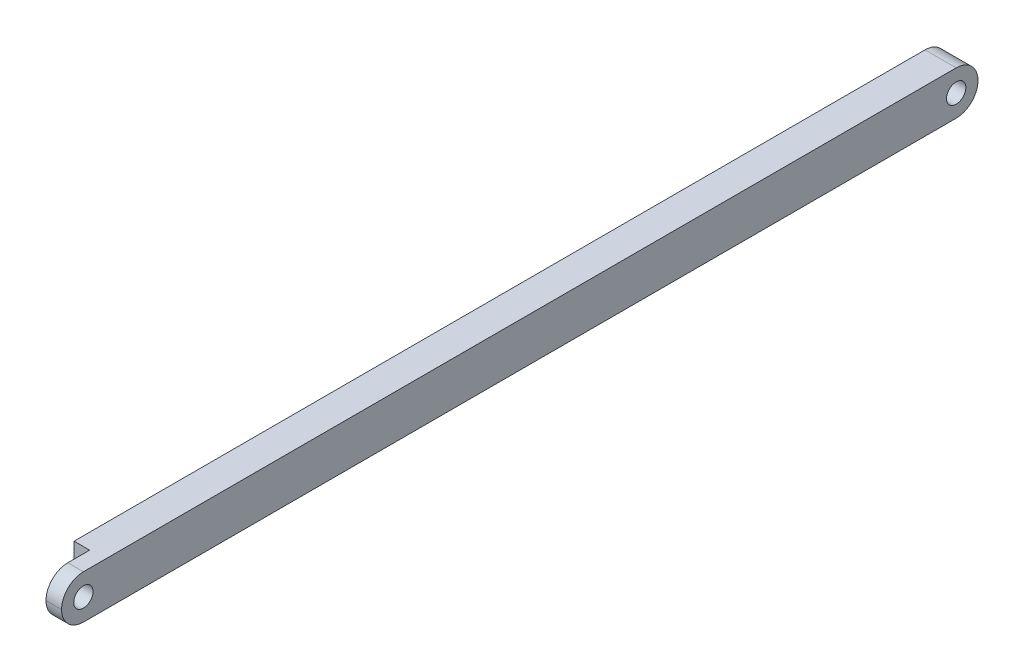
ISO-10303-21;
HEADER;
FILE_DESCRIPTION(('STEP AP214'),'2;1');
FILE_NAME('part.step','',(''),(''),'','','');
FILE_SCHEMA(('AUTOMOTIVE_DESIGN { 1 0 10303 214 1 1 1 1 }'));
ENDSEC;
DATA;
#1=APPLICATION_CONTEXT('core data for automotive mechanical design processes');
#2=APPLICATION_PROTOCOL_DEFINITION('international standard','automotive_design',2000,#1);
#3=PRODUCT_CONTEXT('',#1,'mechanical');
#4=PRODUCT('Part','Part','',(#3));
#5=PRODUCT_RELATED_PRODUCT_CATEGORY('part','',(#4));
#6=PRODUCT_DEFINITION_FORMATION('','',#4);
#7=PRODUCT_DEFINITION_CONTEXT('part definition',#1,'design');
#8=PRODUCT_DEFINITION('design','',#6,#7);
#9=PRODUCT_DEFINITION_SHAPE('','',#8);
#10=(LENGTH_UNIT() NAMED_UNIT(*) SI_UNIT(.MILLI.,.METRE.));
#11=(NAMED_UNIT(*) PLANE_ANGLE_UNIT() SI_UNIT($,.RADIAN.));
#12=(NAMED_UNIT(*) SI_UNIT($,.STERADIAN.) SOLID_ANGLE_UNIT());
#13=UNCERTAINTY_MEASURE_WITH_UNIT(LENGTH_MEASURE(1.E-05),#10,'distance_accuracy_value','');
#14=(GEOMETRIC_REPRESENTATION_CONTEXT(3) GLOBAL_UNCERTAINTY_ASSIGNED_CONTEXT((#13)) GLOBAL_UNIT_ASSIGNED_CONTEXT((#10,
#11,#12)) REPRESENTATION_CONTEXT('',''));
#15=CARTESIAN_POINT('',(0.,0.,0.));
#16=DIRECTION('',(0.,0.,1.));
#17=DIRECTION('',(1.,0.,0.));
#18=AXIS2_PLACEMENT_3D('',#15,#16,#17);
#19=CARTESIAN_POINT('',(2.5,3.5,140.));
#20=DIRECTION('',(-1.,0.,0.));
#21=DIRECTION('',(0.,-1.,0.));
#22=AXIS2_PLACEMENT_3D('',#19,#20,#21);
#23=PLANE('',#22);
#24=CARTESIAN_POINT('',(2.5,0.,143.5));
#25=DIRECTION('',(-1.,0.,0.));
#26=DIRECTION('',(0.,-1.,0.));
#27=AXIS2_PLACEMENT_3D('',#24,#25,#26);
#28=CIRCLE('',#27,1.54999999999999);
#29=CARTESIAN_POINT('',(2.5,-1.55,143.5));
#30=VERTEX_POINT('',#29);
#31=EDGE_CURVE('E121',#30,#30,#28,.T.);
#32=ORIENTED_EDGE('',*,*,#31,.T.);
#33=EDGE_LOOP('',(#32));
#34=FACE_BOUND('',#33,.T.);
#35=CARTESIAN_POINT('',(2.5,0.,3.5));
#36=DIRECTION('',(1.,0.,0.));
#37=DIRECTION('',(0.,1.,0.));
#38=AXIS2_PLACEMENT_3D('',#35,#36,#37);
#39=CIRCLE('',#38,1.55);
#40=CARTESIAN_POINT('',(2.5,1.55,3.5));
#41=VERTEX_POINT('',#40);
#42=EDGE_CURVE('E137',#41,#41,#39,.T.);
#43=ORIENTED_EDGE('',*,*,#42,.F.);
#44=EDGE_LOOP('',(#43));
#45=FACE_BOUND('',#44,.T.);
#46=CARTESIAN_POINT('',(2.5,0.,143.5));
#47=DIRECTION('',(-1.,0.,0.));
#48=DIRECTION('',(0.,-1.,0.));
#49=AXIS2_PLACEMENT_3D('',#46,#47,#48);
#50=CIRCLE('',#49,3.5);
#51=CARTESIAN_POINT('',(2.5,3.5,143.5));
#52=VERTEX_POINT('',#51);
#53=CARTESIAN_POINT('',(2.5,0.,147.));
#54=VERTEX_POINT('',#53);
#55=EDGE_CURVE('E148',#52,#54,#50,.F.);
#56=ORIENTED_EDGE('',*,*,#55,.T.);
#57=CARTESIAN_POINT('',(2.5,0.,143.5));
#58=DIRECTION('',(-1.,0.,0.));
#59=DIRECTION('',(0.,-1.,0.));
#60=AXIS2_PLACEMENT_3D('',#57,#58,#59);
#61=CIRCLE('',#60,3.5);
#62=CARTESIAN_POINT('',(2.5,-3.5,143.5));
#63=VERTEX_POINT('',#62);
#64=EDGE_CURVE('E173',#54,#63,#61,.F.);
#65=ORIENTED_EDGE('',*,*,#64,.T.);
#66=DIRECTION('',(0.,0.,-1.));
#67=VECTOR('',#66,1.);
#68=CARTESIAN_POINT('',(2.5,-3.5,140.));
#69=LINE('',#68,#67);
#70=CARTESIAN_POINT('',(2.5,-3.5,3.5));
#71=VERTEX_POINT('',#70);
#72=EDGE_CURVE('E116',#63,#71,#69,.T.);
#73=ORIENTED_EDGE('',*,*,#72,.T.);
#74=CARTESIAN_POINT('',(2.5,0.,3.5));
#75=DIRECTION('',(-1.,0.,0.));
#76=DIRECTION('',(0.,-1.,0.));
#77=AXIS2_PLACEMENT_3D('',#74,#75,#76);
#78=CIRCLE('',#77,3.5);
#79=CARTESIAN_POINT('',(2.5,0.,0.));
#80=VERTEX_POINT('',#79);
#81=EDGE_CURVE('E153',#71,#80,#78,.F.);
#82=ORIENTED_EDGE('',*,*,#81,.T.);
#83=CARTESIAN_POINT('',(2.5,0.,3.5));
#84=DIRECTION('',(-1.,0.,0.));
#85=DIRECTION('',(0.,-1.,0.));
#86=AXIS2_PLACEMENT_3D('',#83,#84,#85);
#87=CIRCLE('',#86,3.5);
#88=CARTESIAN_POINT('',(2.5,3.5,3.5));
#89=VERTEX_POINT('',#88);
#90=EDGE_CURVE('E155',#80,#89,#87,.F.);
#91=ORIENTED_EDGE('',*,*,#90,.T.);
#92=DIRECTION('',(0.,0.,-1.));
#93=VECTOR('',#92,1.);
#94=CARTESIAN_POINT('',(2.5,3.5,140.));
#95=LINE('',#94,#93);
#96=EDGE_CURVE('E161',#52,#89,#95,.T.);
#97=ORIENTED_EDGE('',*,*,#96,.F.);
#98=EDGE_LOOP('',(#56,#65,#73,#82,#91,#97));
#99=FACE_BOUND('',#98,.T.);
#100=ADVANCED_FACE('F35',(#34,#45,#99),#23,.F.);
#101=CARTESIAN_POINT('',(-2.5,3.5,140.));
#102=DIRECTION('',(0.,-1.,0.));
#103=DIRECTION('',(0.,0.,-1.));
#104=AXIS2_PLACEMENT_3D('',#101,#102,#103);
#105=PLANE('',#104);
#106=DIRECTION('',(0.,0.,-1.));
#107=VECTOR('',#106,1.);
#108=CARTESIAN_POINT('',(0.,3.5,147.));
#109=LINE('',#108,#107);
#110=CARTESIAN_POINT('',(0.,3.5,143.5));
#111=VERTEX_POINT('',#110);
#112=CARTESIAN_POINT('',(0.,3.5,140.));
#113=VERTEX_POINT('',#112);
#114=EDGE_CURVE('E106',#111,#113,#109,.T.);
#115=ORIENTED_EDGE('',*,*,#114,.F.);
#116=DIRECTION('',(-1.,0.,0.));
#117=VECTOR('',#116,1.);
#118=CARTESIAN_POINT('',(2.5,3.5,143.5));
#119=LINE('',#118,#117);
#120=EDGE_CURVE('E11',#111,#52,#119,.F.);
#121=ORIENTED_EDGE('',*,*,#120,.T.);
#122=ORIENTED_EDGE('',*,*,#96,.T.);
#123=DIRECTION('',(-1.,0.,0.));
#124=VECTOR('',#123,1.);
#125=CARTESIAN_POINT('',(-2.5,3.5,3.5));
#126=LINE('',#125,#124);
#127=CARTESIAN_POINT('',(-2.5,3.5,3.5));
#128=VERTEX_POINT('',#127);
#129=EDGE_CURVE('E146',#89,#128,#126,.T.);
#130=ORIENTED_EDGE('',*,*,#129,.T.);
#131=DIRECTION('',(0.,0.,-1.));
#132=VECTOR('',#131,1.);
#133=CARTESIAN_POINT('',(-2.5,3.5,140.));
#134=LINE('',#133,#132);
#135=CARTESIAN_POINT('',(-2.5,3.5,140.));
#136=VERTEX_POINT('',#135);
#137=EDGE_CURVE('E163',#136,#128,#134,.T.);
#138=ORIENTED_EDGE('',*,*,#137,.F.);
#139=DIRECTION('',(-1.,0.,0.));
#140=VECTOR('',#139,1.);
#141=CARTESIAN_POINT('',(-2.5,3.5,140.));
#142=LINE('',#141,#140);
#143=EDGE_CURVE('E142',#113,#136,#142,.T.);
#144=ORIENTED_EDGE('',*,*,#143,.F.);
#145=EDGE_LOOP('',(#115,#121,#122,#130,#138,#144));
#146=FACE_BOUND('',#145,.T.);
#147=ADVANCED_FACE('F211',(#146),#105,.F.);
#148=CARTESIAN_POINT('',(-2.5,3.5,140.));
#149=DIRECTION('',(1.,0.,0.));
#150=DIRECTION('',(0.,1.,0.));
#151=AXIS2_PLACEMENT_3D('',#148,#149,#150);
#152=PLANE('',#151);
#153=CARTESIAN_POINT('',(-2.5,0.,3.5));
#154=DIRECTION('',(1.,0.,0.));
#155=DIRECTION('',(0.,1.,0.));
#156=AXIS2_PLACEMENT_3D('',#153,#154,#155);
#157=CIRCLE('',#156,1.55);
#158=CARTESIAN_POINT('',(-2.5,1.55,3.5));
#159=VERTEX_POINT('',#158);
#160=EDGE_CURVE('E133',#159,#159,#157,.T.);
#161=ORIENTED_EDGE('',*,*,#160,.T.);
#162=EDGE_LOOP('',(#161));
#163=FACE_BOUND('',#162,.T.);
#164=CARTESIAN_POINT('',(-2.5,0.,3.5));
#165=DIRECTION('',(1.,0.,0.));
#166=DIRECTION('',(0.,1.,0.));
#167=AXIS2_PLACEMENT_3D('',#164,#165,#166);
#168=CIRCLE('',#167,3.5);
#169=CARTESIAN_POINT('',(-2.5,0.,0.));
#170=VERTEX_POINT('',#169);
#171=EDGE_CURVE('E151',#128,#170,#168,.F.);
#172=ORIENTED_EDGE('',*,*,#171,.T.);
#173=CARTESIAN_POINT('',(-2.5,0.,3.5));
#174=DIRECTION('',(1.,0.,0.));
#175=DIRECTION('',(0.,1.,0.));
#176=AXIS2_PLACEMENT_3D('',#173,#174,#175);
#177=CIRCLE('',#176,3.5);
#178=CARTESIAN_POINT('',(-2.5,-3.5,3.5));
#179=VERTEX_POINT('',#178);
#180=EDGE_CURVE('E149',#170,#179,#177,.F.);
#181=ORIENTED_EDGE('',*,*,#180,.T.);
#182=DIRECTION('',(0.,0.,-1.));
#183=VECTOR('',#182,1.);
#184=CARTESIAN_POINT('',(-2.5,-3.5,140.));
#185=LINE('',#184,#183);
#186=CARTESIAN_POINT('',(-2.5,-3.5,140.));
#187=VERTEX_POINT('',#186);
#188=EDGE_CURVE('E166',#187,#179,#185,.T.);
#189=ORIENTED_EDGE('',*,*,#188,.F.);
#190=DIRECTION('',(0.,-1.,0.));
#191=VECTOR('',#190,1.);
#192=CARTESIAN_POINT('',(-2.5,3.5,140.));
#193=LINE('',#192,#191);
#194=EDGE_CURVE('E114',#136,#187,#193,.T.);
#195=ORIENTED_EDGE('',*,*,#194,.F.);
#196=ORIENTED_EDGE('',*,*,#137,.T.);
#197=EDGE_LOOP('',(#172,#181,#189,#195,#196));
#198=FACE_BOUND('',#197,.T.);
#199=ADVANCED_FACE('F180',(#163,#198),#152,.F.);
#200=CARTESIAN_POINT('',(-2.5,-3.5,140.));
#201=DIRECTION('',(0.,1.,0.));
#202=DIRECTION('',(0.,0.,1.));
#203=AXIS2_PLACEMENT_3D('',#200,#201,#202);
#204=PLANE('',#203);
#205=ORIENTED_EDGE('',*,*,#72,.F.);
#206=DIRECTION('',(1.,0.,0.));
#207=VECTOR('',#206,1.);
#208=CARTESIAN_POINT('',(0.,-3.5,143.5));
#209=LINE('',#208,#207);
#210=CARTESIAN_POINT('',(0.,-3.5,143.5));
#211=VERTEX_POINT('',#210);
#212=EDGE_CURVE('E104',#63,#211,#209,.F.);
#213=ORIENTED_EDGE('',*,*,#212,.T.);
#214=DIRECTION('',(0.,0.,-1.));
#215=VECTOR('',#214,1.);
#216=CARTESIAN_POINT('',(0.,-3.5,147.));
#217=LINE('',#216,#215);
#218=CARTESIAN_POINT('',(0.,-3.5,140.));
#219=VERTEX_POINT('',#218);
#220=EDGE_CURVE('E97',#211,#219,#217,.T.);
#221=ORIENTED_EDGE('',*,*,#220,.T.);
#222=DIRECTION('',(1.,0.,0.));
#223=VECTOR('',#222,1.);
#224=CARTESIAN_POINT('',(-2.5,-3.5,140.));
#225=LINE('',#224,#223);
#226=EDGE_CURVE('E102',#187,#219,#225,.T.);
#227=ORIENTED_EDGE('',*,*,#226,.F.);
#228=ORIENTED_EDGE('',*,*,#188,.T.);
#229=DIRECTION('',(1.,0.,0.));
#230=VECTOR('',#229,1.);
#231=CARTESIAN_POINT('',(-2.5,-3.5,3.5));
#232=LINE('',#231,#230);
#233=EDGE_CURVE('E158',#179,#71,#232,.T.);
#234=ORIENTED_EDGE('',*,*,#233,.T.);
#235=EDGE_LOOP('',(#205,#213,#221,#227,#228,#234));
#236=FACE_BOUND('',#235,.T.);
#237=ADVANCED_FACE('F100',(#236),#204,.F.);
#238=CARTESIAN_POINT('',(0.,0.,140.));
#239=DIRECTION('',(0.,0.,1.));
#240=DIRECTION('',(1.,0.,0.));
#241=AXIS2_PLACEMENT_3D('',#238,#239,#240);
#242=PLANE('',#241);
#243=DIRECTION('',(0.,-1.,0.));
#244=VECTOR('',#243,1.);
#245=CARTESIAN_POINT('',(0.,3.5,140.));
#246=LINE('',#245,#244);
#247=EDGE_CURVE('E107',#113,#219,#246,.T.);
#248=ORIENTED_EDGE('',*,*,#247,.F.);
#249=ORIENTED_EDGE('',*,*,#143,.T.);
#250=ORIENTED_EDGE('',*,*,#194,.T.);
#251=ORIENTED_EDGE('',*,*,#226,.T.);
#252=EDGE_LOOP('',(#248,#249,#250,#251));
#253=FACE_BOUND('',#252,.T.);
#254=ADVANCED_FACE('F111',(#253),#242,.T.);
#255=CARTESIAN_POINT('',(-2.5,0.,3.5));
#256=DIRECTION('',(-1.,0.,0.));
#257=DIRECTION('',(0.,0.,1.));
#258=AXIS2_PLACEMENT_3D('',#255,#256,#257);
#259=CYLINDRICAL_SURFACE('',#258,3.5);
#260=DIRECTION('',(-1.,0.,0.));
#261=VECTOR('',#260,1.);
#262=CARTESIAN_POINT('',(0.,0.,0.));
#263=LINE('',#262,#261);
#264=EDGE_CURVE('E136',#170,#80,#263,.F.);
#265=ORIENTED_EDGE('',*,*,#264,.F.);
#266=ORIENTED_EDGE('',*,*,#171,.F.);
#267=ORIENTED_EDGE('',*,*,#129,.F.);
#268=ORIENTED_EDGE('',*,*,#90,.F.);
#269=EDGE_LOOP('',(#265,#266,#267,#268));
#270=FACE_BOUND('',#269,.T.);
#271=ADVANCED_FACE('F185',(#270),#259,.T.);
#272=CARTESIAN_POINT('',(-2.5,0.,3.5));
#273=DIRECTION('',(1.,0.,0.));
#274=DIRECTION('',(0.,0.,-1.));
#275=AXIS2_PLACEMENT_3D('',#272,#273,#274);
#276=CYLINDRICAL_SURFACE('',#275,3.5);
#277=ORIENTED_EDGE('',*,*,#180,.F.);
#278=ORIENTED_EDGE('',*,*,#264,.T.);
#279=ORIENTED_EDGE('',*,*,#81,.F.);
#280=ORIENTED_EDGE('',*,*,#233,.F.);
#281=EDGE_LOOP('',(#277,#278,#279,#280));
#282=FACE_BOUND('',#281,.T.);
#283=ADVANCED_FACE('F177',(#282),#276,.T.);
#284=CARTESIAN_POINT('',(-2.5,0.,3.5));
#285=DIRECTION('',(1.,0.,0.));
#286=DIRECTION('',(0.,1.,0.));
#287=AXIS2_PLACEMENT_3D('',#284,#285,#286);
#288=CYLINDRICAL_SURFACE('',#287,1.55);
#289=CARTESIAN_POINT('',(-2.5,1.55,3.5));
#290=CARTESIAN_POINT('',(-2.44791666666667,1.55,3.5));
#291=CARTESIAN_POINT('',(-2.39583333333333,1.55,3.5));
#292=CARTESIAN_POINT('',(-2.29166666666667,1.55,3.5));
#293=CARTESIAN_POINT('',(-2.23958333333333,1.55,3.5));
#294=CARTESIAN_POINT('',(-2.13541666666667,1.55,3.5));
#295=CARTESIAN_POINT('',(-2.08333333333333,1.55,3.5));
#296=CARTESIAN_POINT('',(-1.97916666666667,1.55,3.5));
#297=CARTESIAN_POINT('',(-1.92708333333333,1.55,3.5));
#298=CARTESIAN_POINT('',(-1.82291666666667,1.55,3.5));
#299=CARTESIAN_POINT('',(-1.77083333333333,1.55,3.5));
#300=CARTESIAN_POINT('',(-1.66666666666667,1.55,3.5));
#301=CARTESIAN_POINT('',(-1.61458333333333,1.55,3.5));
#302=CARTESIAN_POINT('',(-1.51041666666667,1.55,3.5));
#303=CARTESIAN_POINT('',(-1.45833333333333,1.55,3.5));
#304=CARTESIAN_POINT('',(-1.35416666666667,1.55,3.5));
#305=CARTESIAN_POINT('',(-1.30208333333333,1.55,3.5));
#306=CARTESIAN_POINT('',(-1.19791666666667,1.55,3.5));
#307=CARTESIAN_POINT('',(-1.14583333333333,1.55,3.5));
#308=CARTESIAN_POINT('',(-1.04166666666667,1.55,3.5));
#309=CARTESIAN_POINT('',(-0.989583333333334,1.55,3.5));
#310=CARTESIAN_POINT('',(-0.885416666666668,1.55,3.5));
#311=CARTESIAN_POINT('',(-0.833333333333334,1.55,3.5));
#312=CARTESIAN_POINT('',(-0.729166666666668,1.55,3.5));
#313=CARTESIAN_POINT('',(-0.677083333333334,1.55,3.5));
#314=CARTESIAN_POINT('',(-0.572916666666667,1.55,3.5));
#315=CARTESIAN_POINT('',(-0.520833333333334,1.55,3.5));
#316=CARTESIAN_POINT('',(-0.416666666666667,1.55,3.5));
#317=CARTESIAN_POINT('',(-0.364583333333334,1.55,3.5));
#318=CARTESIAN_POINT('',(-0.260416666666667,1.55,3.5));
#319=CARTESIAN_POINT('',(-0.208333333333334,1.55,3.5));
#320=CARTESIAN_POINT('',(-0.104166666666667,1.55,3.5));
#321=CARTESIAN_POINT('',(-0.0520833333333338,1.55,3.5));
#322=CARTESIAN_POINT('',(0.0520833333333329,1.55,3.5));
#323=CARTESIAN_POINT('',(0.104166666666666,1.55,3.5));
#324=CARTESIAN_POINT('',(0.208333333333333,1.55,3.5));
#325=CARTESIAN_POINT('',(0.260416666666666,1.55,3.5));
#326=CARTESIAN_POINT('',(0.364583333333333,1.55,3.5));
#327=CARTESIAN_POINT('',(0.416666666666667,1.55,3.5));
#328=CARTESIAN_POINT('',(0.520833333333333,1.55,3.5));
#329=CARTESIAN_POINT('',(0.572916666666667,1.55,3.5));
#330=CARTESIAN_POINT('',(0.677083333333333,1.55,3.5));
#331=CARTESIAN_POINT('',(0.729166666666667,1.55,3.5));
#332=CARTESIAN_POINT('',(0.833333333333333,1.55,3.5));
#333=CARTESIAN_POINT('',(0.885416666666667,1.55,3.5));
#334=CARTESIAN_POINT('',(0.989583333333333,1.55,3.5));
#335=CARTESIAN_POINT('',(1.04166666666667,1.55,3.5));
#336=CARTESIAN_POINT('',(1.14583333333333,1.55,3.5));
#337=CARTESIAN_POINT('',(1.19791666666667,1.55,3.5));
#338=CARTESIAN_POINT('',(1.30208333333333,1.55,3.5));
#339=CARTESIAN_POINT('',(1.35416666666667,1.55,3.5));
#340=CARTESIAN_POINT('',(1.45833333333333,1.55,3.5));
#341=CARTESIAN_POINT('',(1.51041666666667,1.55,3.5));
#342=CARTESIAN_POINT('',(1.61458333333333,1.55,3.5));
#343=CARTESIAN_POINT('',(1.66666666666667,1.55,3.5));
#344=CARTESIAN_POINT('',(1.77083333333333,1.55,3.5));
#345=CARTESIAN_POINT('',(1.82291666666667,1.55,3.5));
#346=CARTESIAN_POINT('',(1.92708333333333,1.55,3.5));
#347=CARTESIAN_POINT('',(1.97916666666667,1.55,3.5));
#348=CARTESIAN_POINT('',(2.08333333333333,1.55,3.5));
#349=CARTESIAN_POINT('',(2.13541666666667,1.55,3.5));
#350=CARTESIAN_POINT('',(2.23958333333333,1.55,3.5));
#351=CARTESIAN_POINT('',(2.29166666666667,1.55,3.5));
#352=CARTESIAN_POINT('',(2.39583333333333,1.55,3.5));
#353=CARTESIAN_POINT('',(2.44791666666667,1.55,3.5));
#354=CARTESIAN_POINT('',(2.5,1.55,3.5));
#355=B_SPLINE_CURVE_WITH_KNOTS('',3,(#289,#290,#291,#292,#293,#294,#295,#296,#297,#298,#299,
#300,#301,#302,#303,#304,#305,#306,#307,#308,#309,#310,#311,#312,#313,#314,#315,#316,#317,#318,
#319,#320,#321,#322,#323,#324,#325,#326,#327,#328,#329,#330,#331,#332,#333,#334,#335,#336,#337,
#338,#339,#340,#341,#342,#343,#344,#345,#346,#347,#348,#349,#350,#351,#352,#353,#354),
.UNSPECIFIED.,.F.,.F.,(4,2,2,2,2,2,2,2,2,2,2,2,2,2,2,2,2,2,2,2,2,2,2,2,2,2,2,2,2,2,2,2,4),(0.,
0.15625,0.3125,0.46875,0.625,0.78125,0.9375,1.09375,1.25,1.40625,1.5625,1.71875,1.875,2.03125,
2.1875,2.34375,2.5,2.65625,2.8125,2.96875,3.125,3.28125,3.4375,3.59375,3.75,3.90625,4.0625,
4.21875,4.375,4.53125,4.6875,4.84375,5.),.UNSPECIFIED.);
#356=EDGE_CURVE('BSEAM223',#159,#41,#355,.T.);
#357=ORIENTED_EDGE('',*,*,#160,.F.);
#358=ORIENTED_EDGE('',*,*,#42,.T.);
#359=ORIENTED_EDGE('',*,*,#356,.T.);
#360=ORIENTED_EDGE('',*,*,#356,.F.);
#361=EDGE_LOOP('',(#357,#359,#358,#360));
#362=FACE_BOUND('',#361,.T.);
#363=ADVANCED_FACE('F223',(#362),#288,.F.);
#364=CARTESIAN_POINT('',(0.,3.5,147.));
#365=DIRECTION('',(1.,0.,0.));
#366=DIRECTION('',(0.,1.,0.));
#367=AXIS2_PLACEMENT_3D('',#364,#365,#366);
#368=PLANE('',#367);
#369=CARTESIAN_POINT('',(0.,0.,143.5));
#370=DIRECTION('',(-1.,0.,0.));
#371=DIRECTION('',(0.,-1.,0.));
#372=AXIS2_PLACEMENT_3D('',#369,#370,#371);
#373=CIRCLE('',#372,1.54999999999999);
#374=CARTESIAN_POINT('',(0.,-1.55,143.5));
#375=VERTEX_POINT('',#374);
#376=EDGE_CURVE('E131',#375,#375,#373,.T.);
#377=ORIENTED_EDGE('',*,*,#376,.F.);
#378=EDGE_LOOP('',(#377));
#379=FACE_BOUND('',#378,.T.);
#380=ORIENTED_EDGE('',*,*,#220,.F.);
#381=CARTESIAN_POINT('',(0.,0.,143.5));
#382=DIRECTION('',(1.,0.,0.));
#383=DIRECTION('',(0.,1.,0.));
#384=AXIS2_PLACEMENT_3D('',#381,#382,#383);
#385=CIRCLE('',#384,3.5);
#386=CARTESIAN_POINT('',(0.,0.,147.));
#387=VERTEX_POINT('',#386);
#388=EDGE_CURVE('E44',#211,#387,#385,.F.);
#389=ORIENTED_EDGE('',*,*,#388,.T.);
#390=CARTESIAN_POINT('',(0.,0.,143.5));
#391=DIRECTION('',(1.,0.,0.));
#392=DIRECTION('',(0.,1.,0.));
#393=AXIS2_PLACEMENT_3D('',#390,#391,#392);
#394=CIRCLE('',#393,3.5);
#395=EDGE_CURVE('E51',#387,#111,#394,.F.);
#396=ORIENTED_EDGE('',*,*,#395,.T.);
#397=ORIENTED_EDGE('',*,*,#114,.T.);
#398=ORIENTED_EDGE('',*,*,#247,.T.);
#399=EDGE_LOOP('',(#380,#389,#396,#397,#398));
#400=FACE_BOUND('',#399,.T.);
#401=ADVANCED_FACE('F118',(#379,#400),#368,.F.);
#402=CARTESIAN_POINT('',(0.,0.,143.5));
#403=DIRECTION('',(1.,0.,0.));
#404=DIRECTION('',(0.,0.,-1.));
#405=AXIS2_PLACEMENT_3D('',#402,#403,#404);
#406=CYLINDRICAL_SURFACE('',#405,3.5);
#407=ORIENTED_EDGE('',*,*,#120,.F.);
#408=ORIENTED_EDGE('',*,*,#395,.F.);
#409=DIRECTION('',(-1.,0.,0.));
#410=VECTOR('',#409,1.);
#411=CARTESIAN_POINT('',(0.,0.,147.));
#412=LINE('',#411,#410);
#413=EDGE_CURVE('E39',#54,#387,#412,.T.);
#414=ORIENTED_EDGE('',*,*,#413,.F.);
#415=ORIENTED_EDGE('',*,*,#55,.F.);
#416=EDGE_LOOP('',(#407,#408,#414,#415));
#417=FACE_BOUND('',#416,.T.);
#418=ADVANCED_FACE('F37',(#417),#406,.T.);
#419=CARTESIAN_POINT('',(0.,0.,143.5));
#420=DIRECTION('',(-1.,0.,0.));
#421=DIRECTION('',(0.,0.,1.));
#422=AXIS2_PLACEMENT_3D('',#419,#420,#421);
#423=CYLINDRICAL_SURFACE('',#422,3.5);
#424=ORIENTED_EDGE('',*,*,#388,.F.);
#425=ORIENTED_EDGE('',*,*,#212,.F.);
#426=ORIENTED_EDGE('',*,*,#64,.F.);
#427=ORIENTED_EDGE('',*,*,#413,.T.);
#428=EDGE_LOOP('',(#424,#425,#426,#427));
#429=FACE_BOUND('',#428,.T.);
#430=ADVANCED_FACE('F200',(#429),#423,.T.);
#431=CARTESIAN_POINT('',(2.5,0.,143.5));
#432=DIRECTION('',(-1.,0.,0.));
#433=DIRECTION('',(0.,-1.,0.));
#434=AXIS2_PLACEMENT_3D('',#431,#432,#433);
#435=CYLINDRICAL_SURFACE('',#434,1.54999999999999);
#436=ORIENTED_EDGE('',*,*,#31,.F.);
#437=EDGE_LOOP('',(#436));
#438=FACE_BOUND('',#437,.T.);
#439=ORIENTED_EDGE('',*,*,#376,.T.);
#440=EDGE_LOOP('',(#439));
#441=FACE_BOUND('',#440,.T.);
#442=ADVANCED_FACE('F202',(#438,#441),#435,.F.);
#443=CLOSED_SHELL('',(#100,#147,#199,#237,#254,#271,#283,#363,#401,#418,#430,#442));
#444=MANIFOLD_SOLID_BREP('B2',#443);
#445=ADVANCED_BREP_SHAPE_REPRESENTATION('',(#18,#444),#14);
#446=SHAPE_DEFINITION_REPRESENTATION(#9,#445);
ENDSEC;
END-ISO-10303-21;
